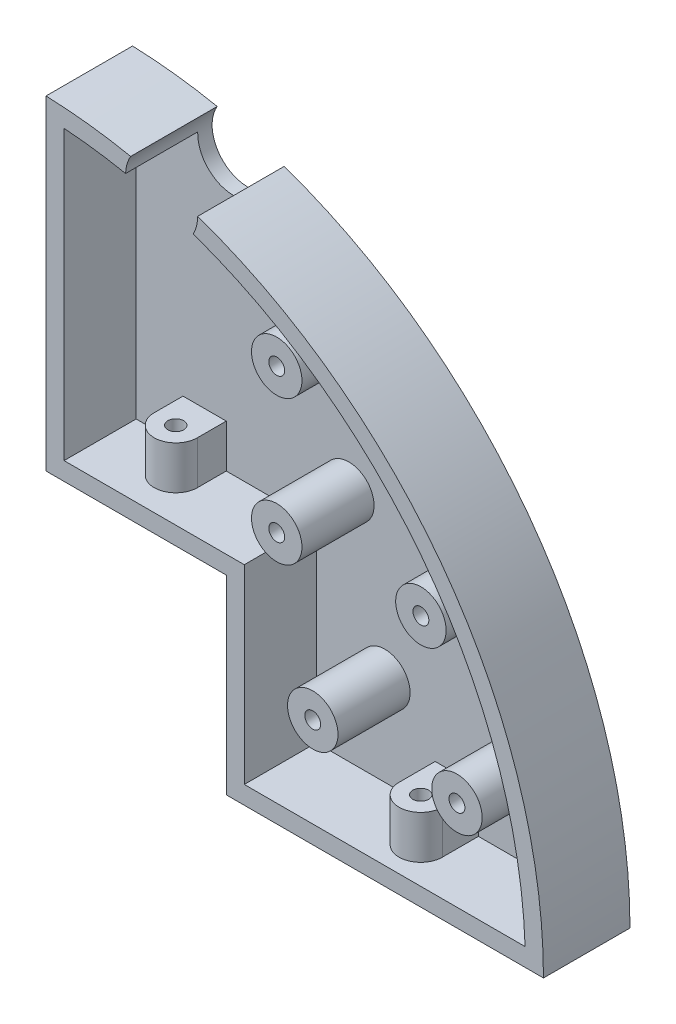
ISO-10303-21;
HEADER;
FILE_DESCRIPTION(('STEP AP214'),'2;1');
FILE_NAME('part.step','',(''),(''),'','','');
FILE_SCHEMA(('AUTOMOTIVE_DESIGN { 1 0 10303 214 1 1 1 1 }'));
ENDSEC;
DATA;
#1=APPLICATION_CONTEXT('core data for automotive mechanical design processes');
#2=APPLICATION_PROTOCOL_DEFINITION('international standard','automotive_design',2000,#1);
#3=PRODUCT_CONTEXT('',#1,'mechanical');
#4=PRODUCT('Part','Part','',(#3));
#5=PRODUCT_RELATED_PRODUCT_CATEGORY('part','',(#4));
#6=PRODUCT_DEFINITION_FORMATION('','',#4);
#7=PRODUCT_DEFINITION_CONTEXT('part definition',#1,'design');
#8=PRODUCT_DEFINITION('design','',#6,#7);
#9=PRODUCT_DEFINITION_SHAPE('','',#8);
#10=(LENGTH_UNIT() NAMED_UNIT(*) SI_UNIT(.MILLI.,.METRE.));
#11=(NAMED_UNIT(*) PLANE_ANGLE_UNIT() SI_UNIT($,.RADIAN.));
#12=(NAMED_UNIT(*) SI_UNIT($,.STERADIAN.) SOLID_ANGLE_UNIT());
#13=UNCERTAINTY_MEASURE_WITH_UNIT(LENGTH_MEASURE(1.E-05),#10,'distance_accuracy_value','');
#14=(GEOMETRIC_REPRESENTATION_CONTEXT(3) GLOBAL_UNCERTAINTY_ASSIGNED_CONTEXT((#13)) GLOBAL_UNIT_ASSIGNED_CONTEXT((#10,
#11,#12)) REPRESENTATION_CONTEXT('',''));
#15=CARTESIAN_POINT('',(0.,0.,0.));
#16=DIRECTION('',(0.,0.,1.));
#17=DIRECTION('',(1.,0.,0.));
#18=AXIS2_PLACEMENT_3D('',#15,#16,#17);
#19=CARTESIAN_POINT('',(0.,0.,2.54));
#20=DIRECTION('',(0.,0.,1.));
#21=DIRECTION('',(1.,0.,0.));
#22=AXIS2_PLACEMENT_3D('',#19,#20,#21);
#23=PLANE('',#22);
#24=CARTESIAN_POINT('',(69.215,44.45,2.54));
#25=DIRECTION('',(0.,0.,1.));
#26=DIRECTION('',(1.,0.,0.));
#27=AXIS2_PLACEMENT_3D('',#24,#25,#26);
#28=CIRCLE('',#27,4.445);
#29=CARTESIAN_POINT('',(73.66,44.45,2.54));
#30=VERTEX_POINT('',#29);
#31=EDGE_CURVE('E276',#30,#30,#28,.T.);
#32=ORIENTED_EDGE('',*,*,#31,.F.);
#33=EDGE_LOOP('',(#32));
#34=FACE_BOUND('',#33,.T.);
#35=CARTESIAN_POINT('',(75.565,19.05,2.54));
#36=DIRECTION('',(0.,0.,1.));
#37=DIRECTION('',(1.,0.,0.));
#38=AXIS2_PLACEMENT_3D('',#35,#36,#37);
#39=CIRCLE('',#38,4.445);
#40=CARTESIAN_POINT('',(80.01,19.05,2.54));
#41=VERTEX_POINT('',#40);
#42=EDGE_CURVE('E284',#41,#41,#39,.T.);
#43=ORIENTED_EDGE('',*,*,#42,.F.);
#44=EDGE_LOOP('',(#43));
#45=FACE_BOUND('',#44,.T.);
#46=CARTESIAN_POINT('',(50.165,19.05,2.54));
#47=DIRECTION('',(0.,0.,1.));
#48=DIRECTION('',(1.,0.,0.));
#49=AXIS2_PLACEMENT_3D('',#46,#47,#48);
#50=CIRCLE('',#49,4.44499999999999);
#51=CARTESIAN_POINT('',(54.61,19.05,2.54));
#52=VERTEX_POINT('',#51);
#53=EDGE_CURVE('E292',#52,#52,#50,.T.);
#54=ORIENTED_EDGE('',*,*,#53,.F.);
#55=EDGE_LOOP('',(#54));
#56=FACE_BOUND('',#55,.T.);
#57=CARTESIAN_POINT('',(43.815,69.85,2.54));
#58=DIRECTION('',(0.,0.,1.));
#59=DIRECTION('',(1.,0.,0.));
#60=AXIS2_PLACEMENT_3D('',#57,#58,#59);
#61=CIRCLE('',#60,4.445);
#62=CARTESIAN_POINT('',(48.26,69.85,2.54));
#63=VERTEX_POINT('',#62);
#64=EDGE_CURVE('E300',#63,#63,#61,.T.);
#65=ORIENTED_EDGE('',*,*,#64,.F.);
#66=EDGE_LOOP('',(#65));
#67=FACE_BOUND('',#66,.T.);
#68=CARTESIAN_POINT('',(43.815,44.45,2.54));
#69=DIRECTION('',(0.,0.,1.));
#70=DIRECTION('',(1.,0.,0.));
#71=AXIS2_PLACEMENT_3D('',#68,#69,#70);
#72=CIRCLE('',#71,4.445);
#73=CARTESIAN_POINT('',(48.26,44.45,2.54));
#74=VERTEX_POINT('',#73);
#75=EDGE_CURVE('E308',#74,#74,#72,.T.);
#76=ORIENTED_EDGE('',*,*,#75,.F.);
#77=EDGE_LOOP('',(#76));
#78=FACE_BOUND('',#77,.T.);
#79=DIRECTION('',(1.,0.,0.));
#80=VECTOR('',#79,1.);
#81=CARTESIAN_POINT('',(38.1,3.175,2.54));
#82=LINE('',#81,#80);
#83=CARTESIAN_POINT('',(38.1,3.175,2.54));
#84=VERTEX_POINT('',#83);
#85=CARTESIAN_POINT('',(59.0262314974696,3.175,2.54));
#86=VERTEX_POINT('',#85);
#87=EDGE_CURVE('E387',#84,#86,#82,.T.);
#88=ORIENTED_EDGE('',*,*,#87,.T.);
#89=DIRECTION('',(0.,-1.,0.));
#90=VECTOR('',#89,1.);
#91=CARTESIAN_POINT('',(59.0262314974696,10.795,2.54));
#92=LINE('',#91,#90);
#93=CARTESIAN_POINT('',(59.0262314974696,10.795,2.54));
#94=VERTEX_POINT('',#93);
#95=EDGE_CURVE('E514',#94,#86,#92,.T.);
#96=ORIENTED_EDGE('',*,*,#95,.F.);
#97=DIRECTION('',(-1.,0.,0.));
#98=VECTOR('',#97,1.);
#99=CARTESIAN_POINT('',(66.6462314974696,10.795,2.54));
#100=LINE('',#99,#98);
#101=CARTESIAN_POINT('',(66.6462314974696,10.795,2.54));
#102=VERTEX_POINT('',#101);
#103=EDGE_CURVE('E201',#102,#94,#100,.T.);
#104=ORIENTED_EDGE('',*,*,#103,.F.);
#105=DIRECTION('',(0.,-1.,0.));
#106=VECTOR('',#105,1.);
#107=CARTESIAN_POINT('',(66.6462314974696,10.795,2.54));
#108=LINE('',#107,#106);
#109=CARTESIAN_POINT('',(66.6462314974696,3.175,2.54));
#110=VERTEX_POINT('',#109);
#111=EDGE_CURVE('E219',#102,#110,#108,.T.);
#112=ORIENTED_EDGE('',*,*,#111,.T.);
#113=CARTESIAN_POINT('',(87.5724629949392,3.175,2.54));
#114=VERTEX_POINT('',#113);
#115=EDGE_CURVE('E386',#110,#114,#82,.T.);
#116=ORIENTED_EDGE('',*,*,#115,.T.);
#117=CARTESIAN_POINT('',(0.,0.,2.54));
#118=DIRECTION('',(0.,0.,1.));
#119=DIRECTION('',(-1.,0.,0.));
#120=AXIS2_PLACEMENT_3D('',#117,#118,#119);
#121=CIRCLE('',#120,87.63);
#122=CARTESIAN_POINT('',(29.099728785197,82.6572603261684,2.54));
#123=VERTEX_POINT('',#122);
#124=EDGE_CURVE('E360',#114,#123,#121,.T.);
#125=ORIENTED_EDGE('',*,*,#124,.T.);
#126=CARTESIAN_POINT('',(23.5407769941292,85.7265525873558,2.54));
#127=DIRECTION('',(0.,0.,1.));
#128=DIRECTION('',(1.,0.,0.));
#129=AXIS2_PLACEMENT_3D('',#126,#127,#128);
#130=CIRCLE('',#129,6.35);
#131=CARTESIAN_POINT('',(17.1939298097885,85.9266296190888,2.54));
#132=VERTEX_POINT('',#131);
#133=EDGE_CURVE('E263',#132,#123,#130,.T.);
#134=ORIENTED_EDGE('',*,*,#133,.F.);
#135=CARTESIAN_POINT('',(6.35000000000002,87.3996247131531,2.54));
#136=VERTEX_POINT('',#135);
#137=EDGE_CURVE('E391',#132,#136,#121,.T.);
#138=ORIENTED_EDGE('',*,*,#137,.T.);
#139=DIRECTION('',(0.,-1.,0.));
#140=VECTOR('',#139,1.);
#141=CARTESIAN_POINT('',(6.35000000000001,36.703,2.54));
#142=LINE('',#141,#140);
#143=CARTESIAN_POINT('',(6.35000000000001,36.703,2.54));
#144=VERTEX_POINT('',#143);
#145=EDGE_CURVE('E355',#136,#144,#142,.T.);
#146=ORIENTED_EDGE('',*,*,#145,.T.);
#147=DIRECTION('',(1.,0.,0.));
#148=VECTOR('',#147,1.);
#149=CARTESIAN_POINT('',(6.35000000000001,36.703,2.54));
#150=LINE('',#149,#148);
#151=CARTESIAN_POINT('',(14.605,36.703,2.54));
#152=VERTEX_POINT('',#151);
#153=EDGE_CURVE('E379',#144,#152,#150,.T.);
#154=ORIENTED_EDGE('',*,*,#153,.T.);
#155=DIRECTION('',(0.,1.,0.));
#156=VECTOR('',#155,1.);
#157=CARTESIAN_POINT('',(14.605,0.,2.54));
#158=LINE('',#157,#156);
#159=CARTESIAN_POINT('',(14.605,44.323,2.54));
#160=VERTEX_POINT('',#159);
#161=EDGE_CURVE('E477',#152,#160,#158,.T.);
#162=ORIENTED_EDGE('',*,*,#161,.T.);
#163=DIRECTION('',(-1.,0.,0.));
#164=VECTOR('',#163,1.);
#165=CARTESIAN_POINT('',(0.,44.323,2.54));
#166=LINE('',#165,#164);
#167=CARTESIAN_POINT('',(22.225,44.323,2.54));
#168=VERTEX_POINT('',#167);
#169=EDGE_CURVE('E473',#168,#160,#166,.T.);
#170=ORIENTED_EDGE('',*,*,#169,.F.);
#171=DIRECTION('',(0.,-1.,0.));
#172=VECTOR('',#171,1.);
#173=CARTESIAN_POINT('',(22.225,0.,2.54));
#174=LINE('',#173,#172);
#175=CARTESIAN_POINT('',(22.225,36.703,2.54));
#176=VERTEX_POINT('',#175);
#177=EDGE_CURVE('E480',#168,#176,#174,.T.);
#178=ORIENTED_EDGE('',*,*,#177,.T.);
#179=CARTESIAN_POINT('',(38.1,36.703,2.54));
#180=VERTEX_POINT('',#179);
#181=EDGE_CURVE('E378',#176,#180,#150,.T.);
#182=ORIENTED_EDGE('',*,*,#181,.T.);
#183=DIRECTION('',(0.,-1.,0.));
#184=VECTOR('',#183,1.);
#185=CARTESIAN_POINT('',(38.1,36.703,2.54));
#186=LINE('',#185,#184);
#187=EDGE_CURVE('E383',#180,#84,#186,.T.);
#188=ORIENTED_EDGE('',*,*,#187,.T.);
#189=EDGE_LOOP('',(#88,#96,#104,#112,#116,#125,#134,#138,#146,#154,#162,#170,#178,#182,#188));
#190=FACE_BOUND('',#189,.T.);
#191=ADVANCED_FACE('F39',(#34,#45,#56,#67,#78,#190),#23,.T.);
#192=CARTESIAN_POINT('',(38.1,3.175,15.24));
#193=DIRECTION('',(0.,1.,0.));
#194=DIRECTION('',(0.,0.,1.));
#195=AXIS2_PLACEMENT_3D('',#192,#193,#194);
#196=PLANE('',#195);
#197=CARTESIAN_POINT('',(62.8362314974696,3.175,8.89));
#198=DIRECTION('',(0.,1.,0.));
#199=DIRECTION('',(0.,0.,1.));
#200=AXIS2_PLACEMENT_3D('',#197,#198,#199);
#201=CIRCLE('',#200,3.81);
#202=CARTESIAN_POINT('',(59.0262314974696,3.175,8.89));
#203=VERTEX_POINT('',#202);
#204=CARTESIAN_POINT('',(66.6462314974696,3.175,8.89));
#205=VERTEX_POINT('',#204);
#206=EDGE_CURVE('E524',#203,#205,#201,.T.);
#207=ORIENTED_EDGE('',*,*,#206,.F.);
#208=DIRECTION('',(0.,0.,1.));
#209=VECTOR('',#208,1.);
#210=CARTESIAN_POINT('',(59.0262314974696,3.175,2.54));
#211=LINE('',#210,#209);
#212=EDGE_CURVE('E209',#86,#203,#211,.T.);
#213=ORIENTED_EDGE('',*,*,#212,.F.);
#214=ORIENTED_EDGE('',*,*,#87,.F.);
#215=DIRECTION('',(0.,0.,-1.));
#216=VECTOR('',#215,1.);
#217=CARTESIAN_POINT('',(38.1,3.175,15.24));
#218=LINE('',#217,#216);
#219=CARTESIAN_POINT('',(38.1,3.175,15.24));
#220=VERTEX_POINT('',#219);
#221=EDGE_CURVE('E402',#220,#84,#218,.T.);
#222=ORIENTED_EDGE('',*,*,#221,.F.);
#223=DIRECTION('',(1.,0.,0.));
#224=VECTOR('',#223,1.);
#225=CARTESIAN_POINT('',(38.1,3.175,15.24));
#226=LINE('',#225,#224);
#227=CARTESIAN_POINT('',(87.5724629949392,3.175,15.24));
#228=VERTEX_POINT('',#227);
#229=EDGE_CURVE('E366',#220,#228,#226,.T.);
#230=ORIENTED_EDGE('',*,*,#229,.T.);
#231=DIRECTION('',(0.,0.,-1.));
#232=VECTOR('',#231,1.);
#233=CARTESIAN_POINT('',(87.5724629949392,3.175,15.24));
#234=LINE('',#233,#232);
#235=EDGE_CURVE('E398',#228,#114,#234,.T.);
#236=ORIENTED_EDGE('',*,*,#235,.T.);
#237=ORIENTED_EDGE('',*,*,#115,.F.);
#238=DIRECTION('',(0.,0.,-1.));
#239=VECTOR('',#238,1.);
#240=CARTESIAN_POINT('',(66.6462314974696,3.175,8.89));
#241=LINE('',#240,#239);
#242=EDGE_CURVE('E205',#205,#110,#241,.T.);
#243=ORIENTED_EDGE('',*,*,#242,.F.);
#244=EDGE_LOOP('',(#207,#213,#214,#222,#230,#236,#237,#243));
#245=FACE_BOUND('',#244,.T.);
#246=ADVANCED_FACE('F513',(#245),#196,.T.);
#247=CARTESIAN_POINT('',(0.,0.,2.54));
#248=DIRECTION('',(0.,0.,-1.));
#249=DIRECTION('',(-1.,0.,0.));
#250=AXIS2_PLACEMENT_3D('',#247,#248,#249);
#251=CYLINDRICAL_SURFACE('',#250,90.805);
#252=CARTESIAN_POINT('',(0.,0.,0.));
#253=DIRECTION('',(0.,0.,1.));
#254=DIRECTION('',(1.,0.,0.));
#255=AXIS2_PLACEMENT_3D('',#252,#253,#254);
#256=CIRCLE('',#255,90.805);
#257=CARTESIAN_POINT('',(90.805,0.,0.));
#258=VERTEX_POINT('',#257);
#259=CARTESIAN_POINT('',(29.8907520956582,85.7443348808299,0.));
#260=VERTEX_POINT('',#259);
#261=EDGE_CURVE('E443',#258,#260,#256,.T.);
#262=ORIENTED_EDGE('',*,*,#261,.T.);
#263=DIRECTION('',(0.,0.,1.));
#264=VECTOR('',#263,1.);
#265=CARTESIAN_POINT('',(29.8907520956582,85.7443348808299,7.62));
#266=LINE('',#265,#264);
#267=CARTESIAN_POINT('',(29.8907520956582,85.7443348808299,15.24));
#268=VERTEX_POINT('',#267);
#269=EDGE_CURVE('E272',#260,#268,#266,.T.);
#270=ORIENTED_EDGE('',*,*,#269,.T.);
#271=CARTESIAN_POINT('',(0.,0.,15.24));
#272=DIRECTION('',(0.,0.,1.));
#273=DIRECTION('',(1.,0.,0.));
#274=AXIS2_PLACEMENT_3D('',#271,#272,#273);
#275=CIRCLE('',#274,90.805);
#276=CARTESIAN_POINT('',(90.805,0.,15.24));
#277=VERTEX_POINT('',#276);
#278=EDGE_CURVE('E427',#277,#268,#275,.T.);
#279=ORIENTED_EDGE('',*,*,#278,.F.);
#280=DIRECTION('',(0.,0.,-1.));
#281=VECTOR('',#280,1.);
#282=CARTESIAN_POINT('',(90.805,0.,2.54));
#283=LINE('',#282,#281);
#284=EDGE_CURVE('E465',#277,#258,#283,.T.);
#285=ORIENTED_EDGE('',*,*,#284,.T.);
#286=EDGE_LOOP('',(#262,#270,#279,#285));
#287=FACE_BOUND('',#286,.T.);
#288=ADVANCED_FACE('F563',(#287),#251,.T.);
#289=CARTESIAN_POINT('',(0.,0.,15.24));
#290=DIRECTION('',(0.,0.,-1.));
#291=DIRECTION('',(-1.,0.,0.));
#292=AXIS2_PLACEMENT_3D('',#289,#290,#291);
#293=CYLINDRICAL_SURFACE('',#292,87.63);
#294=DIRECTION('',(0.,0.,1.));
#295=VECTOR('',#294,1.);
#296=CARTESIAN_POINT('',(29.0997287851969,82.6572603261685,7.62));
#297=LINE('',#296,#295);
#298=CARTESIAN_POINT('',(29.0997287851969,82.6572603261684,15.24));
#299=VERTEX_POINT('',#298);
#300=EDGE_CURVE('E11',#123,#299,#297,.T.);
#301=ORIENTED_EDGE('',*,*,#300,.F.);
#302=ORIENTED_EDGE('',*,*,#124,.F.);
#303=ORIENTED_EDGE('',*,*,#235,.F.);
#304=CARTESIAN_POINT('',(0.,0.,15.24));
#305=DIRECTION('',(0.,0.,1.));
#306=DIRECTION('',(-1.,0.,0.));
#307=AXIS2_PLACEMENT_3D('',#304,#305,#306);
#308=CIRCLE('',#307,87.63);
#309=EDGE_CURVE('E371',#228,#299,#308,.T.);
#310=ORIENTED_EDGE('',*,*,#309,.T.);
#311=EDGE_LOOP('',(#301,#302,#303,#310));
#312=FACE_BOUND('',#311,.T.);
#313=ADVANCED_FACE('F595',(#312),#293,.F.);
#314=CARTESIAN_POINT('',(6.35000000000001,36.703,15.24));
#315=DIRECTION('',(0.,1.,0.));
#316=DIRECTION('',(-1.,0.,0.));
#317=AXIS2_PLACEMENT_3D('',#314,#315,#316);
#318=PLANE('',#317);
#319=ORIENTED_EDGE('',*,*,#181,.F.);
#320=DIRECTION('',(0.,0.,-1.));
#321=VECTOR('',#320,1.);
#322=CARTESIAN_POINT('',(22.225,36.703,0.));
#323=LINE('',#322,#321);
#324=CARTESIAN_POINT('',(22.225,36.703,7.62));
#325=VERTEX_POINT('',#324);
#326=EDGE_CURVE('E341',#325,#176,#323,.T.);
#327=ORIENTED_EDGE('',*,*,#326,.F.);
#328=CARTESIAN_POINT('',(18.415,36.703,7.62));
#329=DIRECTION('',(0.,1.,0.));
#330=DIRECTION('',(-1.,0.,0.));
#331=AXIS2_PLACEMENT_3D('',#328,#329,#330);
#332=CIRCLE('',#331,3.81);
#333=CARTESIAN_POINT('',(14.605,36.703,7.62));
#334=VERTEX_POINT('',#333);
#335=EDGE_CURVE('E324',#334,#325,#332,.T.);
#336=ORIENTED_EDGE('',*,*,#335,.F.);
#337=DIRECTION('',(0.,0.,1.));
#338=VECTOR('',#337,1.);
#339=CARTESIAN_POINT('',(14.605,36.703,7.62));
#340=LINE('',#339,#338);
#341=EDGE_CURVE('E330',#152,#334,#340,.T.);
#342=ORIENTED_EDGE('',*,*,#341,.F.);
#343=ORIENTED_EDGE('',*,*,#153,.F.);
#344=DIRECTION('',(0.,0.,-1.));
#345=VECTOR('',#344,1.);
#346=CARTESIAN_POINT('',(6.35000000000001,36.703,15.24));
#347=LINE('',#346,#345);
#348=CARTESIAN_POINT('',(6.35000000000001,36.703,15.24));
#349=VERTEX_POINT('',#348);
#350=EDGE_CURVE('E410',#349,#144,#347,.T.);
#351=ORIENTED_EDGE('',*,*,#350,.F.);
#352=DIRECTION('',(1.,0.,0.));
#353=VECTOR('',#352,1.);
#354=CARTESIAN_POINT('',(6.35000000000001,36.703,15.24));
#355=LINE('',#354,#353);
#356=CARTESIAN_POINT('',(38.1,36.703,15.24));
#357=VERTEX_POINT('',#356);
#358=EDGE_CURVE('E359',#349,#357,#355,.T.);
#359=ORIENTED_EDGE('',*,*,#358,.T.);
#360=DIRECTION('',(0.,0.,-1.));
#361=VECTOR('',#360,1.);
#362=CARTESIAN_POINT('',(38.1,36.703,15.24));
#363=LINE('',#362,#361);
#364=EDGE_CURVE('E406',#357,#180,#363,.T.);
#365=ORIENTED_EDGE('',*,*,#364,.T.);
#366=EDGE_LOOP('',(#319,#327,#336,#342,#343,#351,#359,#365));
#367=FACE_BOUND('',#366,.T.);
#368=ADVANCED_FACE('F503',(#367),#318,.T.);
#369=CARTESIAN_POINT('',(34.925,0.,2.54));
#370=DIRECTION('',(1.,0.,0.));
#371=DIRECTION('',(0.,0.,-1.));
#372=AXIS2_PLACEMENT_3D('',#369,#370,#371);
#373=PLANE('',#372);
#374=DIRECTION('',(0.,-1.,0.));
#375=VECTOR('',#374,1.);
#376=CARTESIAN_POINT('',(34.925,0.,0.));
#377=LINE('',#376,#375);
#378=CARTESIAN_POINT('',(34.925,33.528,0.));
#379=VERTEX_POINT('',#378);
#380=CARTESIAN_POINT('',(34.925,0.,0.));
#381=VERTEX_POINT('',#380);
#382=EDGE_CURVE('E435',#379,#381,#377,.T.);
#383=ORIENTED_EDGE('',*,*,#382,.T.);
#384=DIRECTION('',(0.,0.,-1.));
#385=VECTOR('',#384,1.);
#386=CARTESIAN_POINT('',(34.925,0.,2.54));
#387=LINE('',#386,#385);
#388=CARTESIAN_POINT('',(34.925,0.,15.24));
#389=VERTEX_POINT('',#388);
#390=EDGE_CURVE('E469',#389,#381,#387,.T.);
#391=ORIENTED_EDGE('',*,*,#390,.F.);
#392=DIRECTION('',(0.,-1.,0.));
#393=VECTOR('',#392,1.);
#394=CARTESIAN_POINT('',(34.925,33.528,15.24));
#395=LINE('',#394,#393);
#396=CARTESIAN_POINT('',(34.925,33.528,15.24));
#397=VERTEX_POINT('',#396);
#398=EDGE_CURVE('E418',#397,#389,#395,.T.);
#399=ORIENTED_EDGE('',*,*,#398,.F.);
#400=DIRECTION('',(0.,0.,-1.));
#401=VECTOR('',#400,1.);
#402=CARTESIAN_POINT('',(34.925,33.528,2.54));
#403=LINE('',#402,#401);
#404=EDGE_CURVE('E453',#397,#379,#403,.T.);
#405=ORIENTED_EDGE('',*,*,#404,.T.);
#406=EDGE_LOOP('',(#383,#391,#399,#405));
#407=FACE_BOUND('',#406,.T.);
#408=ADVANCED_FACE('F41',(#407),#373,.F.);
#409=CARTESIAN_POINT('',(34.925,0.,2.54));
#410=DIRECTION('',(0.,1.,0.));
#411=DIRECTION('',(0.,0.,1.));
#412=AXIS2_PLACEMENT_3D('',#409,#410,#411);
#413=PLANE('',#412);
#414=CARTESIAN_POINT('',(62.8362314974696,0.,8.89));
#415=DIRECTION('',(0.,1.,0.));
#416=DIRECTION('',(0.,0.,1.));
#417=AXIS2_PLACEMENT_3D('',#414,#415,#416);
#418=CIRCLE('',#417,1.39699999999999);
#419=CARTESIAN_POINT('',(62.8362314974696,0.,10.287));
#420=VERTEX_POINT('',#419);
#421=EDGE_CURVE('E528',#420,#420,#418,.T.);
#422=ORIENTED_EDGE('',*,*,#421,.T.);
#423=EDGE_LOOP('',(#422));
#424=FACE_BOUND('',#423,.T.);
#425=DIRECTION('',(1.,0.,0.));
#426=VECTOR('',#425,1.);
#427=CARTESIAN_POINT('',(34.925,0.,0.));
#428=LINE('',#427,#426);
#429=EDGE_CURVE('E439',#381,#258,#428,.T.);
#430=ORIENTED_EDGE('',*,*,#429,.T.);
#431=ORIENTED_EDGE('',*,*,#284,.F.);
#432=DIRECTION('',(1.,0.,0.));
#433=VECTOR('',#432,1.);
#434=CARTESIAN_POINT('',(34.925,0.,15.24));
#435=LINE('',#434,#433);
#436=EDGE_CURVE('E422',#389,#277,#435,.T.);
#437=ORIENTED_EDGE('',*,*,#436,.F.);
#438=ORIENTED_EDGE('',*,*,#390,.T.);
#439=EDGE_LOOP('',(#430,#431,#437,#438));
#440=FACE_BOUND('',#439,.T.);
#441=ADVANCED_FACE('F540',(#424,#440),#413,.F.);
#442=CARTESIAN_POINT('',(18.0903958705901,88.9847492677557,15.24));
#443=VERTEX_POINT('',#442);
#444=CARTESIAN_POINT('',(3.17500000000001,90.7494760315452,15.24));
#445=VERTEX_POINT('',#444);
#446=EDGE_CURVE('E426',#443,#445,#275,.T.);
#447=ORIENTED_EDGE('',*,*,#446,.F.);
#448=DIRECTION('',(0.,0.,1.));
#449=VECTOR('',#448,1.);
#450=CARTESIAN_POINT('',(18.0903958705901,88.9847492677557,7.62));
#451=LINE('',#450,#449);
#452=CARTESIAN_POINT('',(18.0903958705901,88.9847492677557,0.));
#453=VERTEX_POINT('',#452);
#454=EDGE_CURVE('E268',#443,#453,#451,.F.);
#455=ORIENTED_EDGE('',*,*,#454,.T.);
#456=CARTESIAN_POINT('',(3.17500000000001,90.7494760315452,0.));
#457=VERTEX_POINT('',#456);
#458=EDGE_CURVE('E442',#453,#457,#256,.T.);
#459=ORIENTED_EDGE('',*,*,#458,.T.);
#460=DIRECTION('',(0.,0.,-1.));
#461=VECTOR('',#460,1.);
#462=CARTESIAN_POINT('',(3.17500000000001,90.7494760315452,2.54));
#463=LINE('',#462,#461);
#464=EDGE_CURVE('E461',#445,#457,#463,.T.);
#465=ORIENTED_EDGE('',*,*,#464,.F.);
#466=EDGE_LOOP('',(#447,#455,#459,#465));
#467=FACE_BOUND('',#466,.T.);
#468=ADVANCED_FACE('F582',(#467),#251,.T.);
#469=CARTESIAN_POINT('',(3.175,33.528,2.54));
#470=DIRECTION('',(1.,0.,0.));
#471=DIRECTION('',(0.,1.,0.));
#472=AXIS2_PLACEMENT_3D('',#469,#470,#471);
#473=PLANE('',#472);
#474=DIRECTION('',(0.,-1.,0.));
#475=VECTOR('',#474,1.);
#476=CARTESIAN_POINT('',(3.175,33.528,0.));
#477=LINE('',#476,#475);
#478=CARTESIAN_POINT('',(3.175,33.528,0.));
#479=VERTEX_POINT('',#478);
#480=EDGE_CURVE('E447',#457,#479,#477,.T.);
#481=ORIENTED_EDGE('',*,*,#480,.T.);
#482=DIRECTION('',(0.,0.,-1.));
#483=VECTOR('',#482,1.);
#484=CARTESIAN_POINT('',(3.175,33.528,2.54));
#485=LINE('',#484,#483);
#486=CARTESIAN_POINT('',(3.175,33.528,15.24));
#487=VERTEX_POINT('',#486);
#488=EDGE_CURVE('E457',#487,#479,#485,.T.);
#489=ORIENTED_EDGE('',*,*,#488,.F.);
#490=DIRECTION('',(0.,-1.,0.));
#491=VECTOR('',#490,1.);
#492=CARTESIAN_POINT('',(3.17500000000001,90.7494760315452,15.24));
#493=LINE('',#492,#491);
#494=EDGE_CURVE('E431',#445,#487,#493,.T.);
#495=ORIENTED_EDGE('',*,*,#494,.F.);
#496=ORIENTED_EDGE('',*,*,#464,.T.);
#497=EDGE_LOOP('',(#481,#489,#495,#496));
#498=FACE_BOUND('',#497,.T.);
#499=ADVANCED_FACE('F578',(#498),#473,.F.);
#500=CARTESIAN_POINT('',(34.925,33.528,2.54));
#501=DIRECTION('',(0.,1.,0.));
#502=DIRECTION('',(0.,0.,1.));
#503=AXIS2_PLACEMENT_3D('',#500,#501,#502);
#504=PLANE('',#503);
#505=CARTESIAN_POINT('',(18.415,33.528,7.62));
#506=DIRECTION('',(0.,1.,0.));
#507=DIRECTION('',(0.,0.,1.));
#508=AXIS2_PLACEMENT_3D('',#505,#506,#507);
#509=CIRCLE('',#508,1.397);
#510=CARTESIAN_POINT('',(18.415,33.528,9.017));
#511=VERTEX_POINT('',#510);
#512=EDGE_CURVE('E320',#511,#511,#509,.T.);
#513=ORIENTED_EDGE('',*,*,#512,.T.);
#514=EDGE_LOOP('',(#513));
#515=FACE_BOUND('',#514,.T.);
#516=DIRECTION('',(1.,0.,0.));
#517=VECTOR('',#516,1.);
#518=CARTESIAN_POINT('',(34.925,33.528,0.));
#519=LINE('',#518,#517);
#520=EDGE_CURVE('E450',#479,#379,#519,.T.);
#521=ORIENTED_EDGE('',*,*,#520,.T.);
#522=ORIENTED_EDGE('',*,*,#404,.F.);
#523=DIRECTION('',(1.,0.,0.));
#524=VECTOR('',#523,1.);
#525=CARTESIAN_POINT('',(3.175,33.528,15.24));
#526=LINE('',#525,#524);
#527=EDGE_CURVE('E414',#487,#397,#526,.T.);
#528=ORIENTED_EDGE('',*,*,#527,.F.);
#529=ORIENTED_EDGE('',*,*,#488,.T.);
#530=EDGE_LOOP('',(#521,#522,#528,#529));
#531=FACE_BOUND('',#530,.T.);
#532=ADVANCED_FACE('F574',(#515,#531),#504,.F.);
#533=CARTESIAN_POINT('',(0.,0.,0.));
#534=DIRECTION('',(0.,0.,1.));
#535=DIRECTION('',(1.,0.,0.));
#536=AXIS2_PLACEMENT_3D('',#533,#534,#535);
#537=PLANE('',#536);
#538=CARTESIAN_POINT('',(43.815,69.85,0.));
#539=DIRECTION('',(0.,0.,1.));
#540=DIRECTION('',(1.,0.,0.));
#541=AXIS2_PLACEMENT_3D('',#538,#539,#540);
#542=CIRCLE('',#541,1.39700000000001);
#543=CARTESIAN_POINT('',(45.212,69.85,0.));
#544=VERTEX_POINT('',#543);
#545=EDGE_CURVE('E223',#544,#544,#542,.T.);
#546=ORIENTED_EDGE('',*,*,#545,.T.);
#547=EDGE_LOOP('',(#546));
#548=FACE_BOUND('',#547,.T.);
#549=CARTESIAN_POINT('',(43.815,44.45,0.));
#550=DIRECTION('',(0.,0.,1.));
#551=DIRECTION('',(1.,0.,0.));
#552=AXIS2_PLACEMENT_3D('',#549,#550,#551);
#553=CIRCLE('',#552,1.39700000000001);
#554=CARTESIAN_POINT('',(45.212,44.45,0.));
#555=VERTEX_POINT('',#554);
#556=EDGE_CURVE('E232',#555,#555,#553,.T.);
#557=ORIENTED_EDGE('',*,*,#556,.T.);
#558=EDGE_LOOP('',(#557));
#559=FACE_BOUND('',#558,.T.);
#560=CARTESIAN_POINT('',(69.215,44.45,0.));
#561=DIRECTION('',(0.,0.,1.));
#562=DIRECTION('',(1.,0.,0.));
#563=AXIS2_PLACEMENT_3D('',#560,#561,#562);
#564=CIRCLE('',#563,1.39699999999999);
#565=CARTESIAN_POINT('',(70.612,44.45,0.));
#566=VERTEX_POINT('',#565);
#567=EDGE_CURVE('E240',#566,#566,#564,.T.);
#568=ORIENTED_EDGE('',*,*,#567,.T.);
#569=EDGE_LOOP('',(#568));
#570=FACE_BOUND('',#569,.T.);
#571=CARTESIAN_POINT('',(75.565,19.05,0.));
#572=DIRECTION('',(0.,0.,1.));
#573=DIRECTION('',(1.,0.,0.));
#574=AXIS2_PLACEMENT_3D('',#571,#572,#573);
#575=CIRCLE('',#574,1.39699999999999);
#576=CARTESIAN_POINT('',(76.962,19.05,0.));
#577=VERTEX_POINT('',#576);
#578=EDGE_CURVE('E248',#577,#577,#575,.T.);
#579=ORIENTED_EDGE('',*,*,#578,.T.);
#580=EDGE_LOOP('',(#579));
#581=FACE_BOUND('',#580,.T.);
#582=CARTESIAN_POINT('',(50.165,19.05,0.));
#583=DIRECTION('',(0.,0.,1.));
#584=DIRECTION('',(1.,0.,0.));
#585=AXIS2_PLACEMENT_3D('',#582,#583,#584);
#586=CIRCLE('',#585,1.39700000000001);
#587=CARTESIAN_POINT('',(51.562,19.05,0.));
#588=VERTEX_POINT('',#587);
#589=EDGE_CURVE('E217',#588,#588,#586,.T.);
#590=ORIENTED_EDGE('',*,*,#589,.T.);
#591=EDGE_LOOP('',(#590));
#592=FACE_BOUND('',#591,.T.);
#593=ORIENTED_EDGE('',*,*,#458,.F.);
#594=CARTESIAN_POINT('',(23.5407769941292,85.7265525873558,0.));
#595=DIRECTION('',(0.,0.,1.));
#596=DIRECTION('',(1.,0.,0.));
#597=AXIS2_PLACEMENT_3D('',#594,#595,#596);
#598=CIRCLE('',#597,6.35);
#599=EDGE_CURVE('E259',#453,#260,#598,.T.);
#600=ORIENTED_EDGE('',*,*,#599,.T.);
#601=ORIENTED_EDGE('',*,*,#261,.F.);
#602=ORIENTED_EDGE('',*,*,#429,.F.);
#603=ORIENTED_EDGE('',*,*,#382,.F.);
#604=ORIENTED_EDGE('',*,*,#520,.F.);
#605=ORIENTED_EDGE('',*,*,#480,.F.);
#606=EDGE_LOOP('',(#593,#600,#601,#602,#603,#604,#605));
#607=FACE_BOUND('',#606,.T.);
#608=ADVANCED_FACE('F571',(#548,#559,#570,#581,#592,#607),#537,.F.);
#609=CARTESIAN_POINT('',(0.,0.,15.24));
#610=DIRECTION('',(0.,0.,1.));
#611=DIRECTION('',(1.,0.,0.));
#612=AXIS2_PLACEMENT_3D('',#609,#610,#611);
#613=PLANE('',#612);
#614=CARTESIAN_POINT('',(23.5407769941292,85.7265525873558,15.24));
#615=DIRECTION('',(0.,0.,1.));
#616=DIRECTION('',(1.,0.,0.));
#617=AXIS2_PLACEMENT_3D('',#614,#615,#616);
#618=CIRCLE('',#617,6.35);
#619=CARTESIAN_POINT('',(17.1939298097885,85.9266296190888,15.24));
#620=VERTEX_POINT('',#619);
#621=EDGE_CURVE('E63',#443,#620,#618,.T.);
#622=ORIENTED_EDGE('',*,*,#621,.F.);
#623=ORIENTED_EDGE('',*,*,#446,.T.);
#624=ORIENTED_EDGE('',*,*,#494,.T.);
#625=ORIENTED_EDGE('',*,*,#527,.T.);
#626=ORIENTED_EDGE('',*,*,#398,.T.);
#627=ORIENTED_EDGE('',*,*,#436,.T.);
#628=ORIENTED_EDGE('',*,*,#278,.T.);
#629=EDGE_CURVE('E227',#299,#268,#618,.T.);
#630=ORIENTED_EDGE('',*,*,#629,.F.);
#631=ORIENTED_EDGE('',*,*,#309,.F.);
#632=ORIENTED_EDGE('',*,*,#229,.F.);
#633=DIRECTION('',(0.,-1.,0.));
#634=VECTOR('',#633,1.);
#635=CARTESIAN_POINT('',(38.1,36.703,15.24));
#636=LINE('',#635,#634);
#637=EDGE_CURVE('E363',#357,#220,#636,.T.);
#638=ORIENTED_EDGE('',*,*,#637,.F.);
#639=ORIENTED_EDGE('',*,*,#358,.F.);
#640=DIRECTION('',(0.,-1.,0.));
#641=VECTOR('',#640,1.);
#642=CARTESIAN_POINT('',(6.35000000000001,36.703,15.24));
#643=LINE('',#642,#641);
#644=CARTESIAN_POINT('',(6.35000000000002,87.3996247131531,15.24));
#645=VERTEX_POINT('',#644);
#646=EDGE_CURVE('E356',#645,#349,#643,.T.);
#647=ORIENTED_EDGE('',*,*,#646,.F.);
#648=EDGE_CURVE('E370',#620,#645,#308,.T.);
#649=ORIENTED_EDGE('',*,*,#648,.F.);
#650=EDGE_LOOP('',(#622,#623,#624,#625,#626,#627,#628,#630,#631,#632,#638,#639,#647,#649));
#651=FACE_BOUND('',#650,.T.);
#652=ADVANCED_FACE('F569',(#651),#613,.T.);
#653=CARTESIAN_POINT('',(6.35000000000001,36.703,15.24));
#654=DIRECTION('',(1.,0.,0.));
#655=DIRECTION('',(0.,0.,-1.));
#656=AXIS2_PLACEMENT_3D('',#653,#654,#655);
#657=PLANE('',#656);
#658=ORIENTED_EDGE('',*,*,#145,.F.);
#659=DIRECTION('',(0.,0.,-1.));
#660=VECTOR('',#659,1.);
#661=CARTESIAN_POINT('',(6.35000000000002,87.3996247131531,15.24));
#662=LINE('',#661,#660);
#663=EDGE_CURVE('E375',#645,#136,#662,.T.);
#664=ORIENTED_EDGE('',*,*,#663,.F.);
#665=ORIENTED_EDGE('',*,*,#646,.T.);
#666=ORIENTED_EDGE('',*,*,#350,.T.);
#667=EDGE_LOOP('',(#658,#664,#665,#666));
#668=FACE_BOUND('',#667,.T.);
#669=ADVANCED_FACE('F615',(#668),#657,.T.);
#670=CARTESIAN_POINT('',(38.1,36.703,15.24));
#671=DIRECTION('',(1.,0.,0.));
#672=DIRECTION('',(0.,1.,0.));
#673=AXIS2_PLACEMENT_3D('',#670,#671,#672);
#674=PLANE('',#673);
#675=ORIENTED_EDGE('',*,*,#187,.F.);
#676=ORIENTED_EDGE('',*,*,#364,.F.);
#677=ORIENTED_EDGE('',*,*,#637,.T.);
#678=ORIENTED_EDGE('',*,*,#221,.T.);
#679=EDGE_LOOP('',(#675,#676,#677,#678));
#680=FACE_BOUND('',#679,.T.);
#681=ADVANCED_FACE('F508',(#680),#674,.T.);
#682=DIRECTION('',(0.,0.,1.));
#683=VECTOR('',#682,1.);
#684=CARTESIAN_POINT('',(17.1939298097885,85.9266296190888,7.62));
#685=LINE('',#684,#683);
#686=EDGE_CURVE('E48',#620,#132,#685,.F.);
#687=ORIENTED_EDGE('',*,*,#686,.F.);
#688=ORIENTED_EDGE('',*,*,#648,.T.);
#689=ORIENTED_EDGE('',*,*,#663,.T.);
#690=ORIENTED_EDGE('',*,*,#137,.F.);
#691=EDGE_LOOP('',(#687,#688,#689,#690));
#692=FACE_BOUND('',#691,.T.);
#693=ADVANCED_FACE('F492',(#692),#293,.F.);
#694=CARTESIAN_POINT('',(18.415,44.323,7.62));
#695=DIRECTION('',(0.,-1.,0.));
#696=DIRECTION('',(1.,0.,0.));
#697=AXIS2_PLACEMENT_3D('',#694,#695,#696);
#698=CYLINDRICAL_SURFACE('',#697,3.81);
#699=ORIENTED_EDGE('',*,*,#335,.T.);
#700=DIRECTION('',(0.,-1.,0.));
#701=VECTOR('',#700,1.);
#702=CARTESIAN_POINT('',(22.225,44.323,7.62));
#703=LINE('',#702,#701);
#704=CARTESIAN_POINT('',(22.225,44.323,7.62));
#705=VERTEX_POINT('',#704);
#706=EDGE_CURVE('E351',#705,#325,#703,.T.);
#707=ORIENTED_EDGE('',*,*,#706,.F.);
#708=CARTESIAN_POINT('',(18.415,44.323,7.62));
#709=DIRECTION('',(0.,1.,0.));
#710=DIRECTION('',(-1.,0.,0.));
#711=AXIS2_PLACEMENT_3D('',#708,#709,#710);
#712=CIRCLE('',#711,3.81);
#713=CARTESIAN_POINT('',(14.605,44.323,7.62));
#714=VERTEX_POINT('',#713);
#715=EDGE_CURVE('E325',#714,#705,#712,.T.);
#716=ORIENTED_EDGE('',*,*,#715,.F.);
#717=DIRECTION('',(0.,-1.,0.));
#718=VECTOR('',#717,1.);
#719=CARTESIAN_POINT('',(14.605,44.323,7.62));
#720=LINE('',#719,#718);
#721=EDGE_CURVE('E337',#714,#334,#720,.T.);
#722=ORIENTED_EDGE('',*,*,#721,.T.);
#723=EDGE_LOOP('',(#699,#707,#716,#722));
#724=FACE_BOUND('',#723,.T.);
#725=ADVANCED_FACE('F627',(#724),#698,.T.);
#726=CARTESIAN_POINT('',(22.225,44.323,0.));
#727=DIRECTION('',(-1.,0.,0.));
#728=DIRECTION('',(0.,0.,1.));
#729=AXIS2_PLACEMENT_3D('',#726,#727,#728);
#730=PLANE('',#729);
#731=ORIENTED_EDGE('',*,*,#177,.F.);
#732=DIRECTION('',(0.,0.,-1.));
#733=VECTOR('',#732,1.);
#734=CARTESIAN_POINT('',(22.225,44.323,0.));
#735=LINE('',#734,#733);
#736=EDGE_CURVE('E329',#705,#168,#735,.T.);
#737=ORIENTED_EDGE('',*,*,#736,.F.);
#738=ORIENTED_EDGE('',*,*,#706,.T.);
#739=ORIENTED_EDGE('',*,*,#326,.T.);
#740=EDGE_LOOP('',(#731,#737,#738,#739));
#741=FACE_BOUND('',#740,.T.);
#742=ADVANCED_FACE('F632',(#741),#730,.F.);
#743=CARTESIAN_POINT('',(14.605,44.323,7.62));
#744=DIRECTION('',(1.,0.,0.));
#745=DIRECTION('',(0.,0.,-1.));
#746=AXIS2_PLACEMENT_3D('',#743,#744,#745);
#747=PLANE('',#746);
#748=ORIENTED_EDGE('',*,*,#161,.F.);
#749=ORIENTED_EDGE('',*,*,#341,.T.);
#750=ORIENTED_EDGE('',*,*,#721,.F.);
#751=DIRECTION('',(0.,0.,1.));
#752=VECTOR('',#751,1.);
#753=CARTESIAN_POINT('',(14.605,44.323,7.62));
#754=LINE('',#753,#752);
#755=EDGE_CURVE('E334',#160,#714,#754,.T.);
#756=ORIENTED_EDGE('',*,*,#755,.F.);
#757=EDGE_LOOP('',(#748,#749,#750,#756));
#758=FACE_BOUND('',#757,.T.);
#759=ADVANCED_FACE('F721',(#758),#747,.F.);
#760=CARTESIAN_POINT('',(18.415,44.323,7.62));
#761=DIRECTION('',(0.,1.,0.));
#762=DIRECTION('',(-1.,0.,0.));
#763=AXIS2_PLACEMENT_3D('',#760,#761,#762);
#764=PLANE('',#763);
#765=CARTESIAN_POINT('',(18.415,44.323,7.62));
#766=DIRECTION('',(0.,1.,0.));
#767=DIRECTION('',(-1.,0.,0.));
#768=AXIS2_PLACEMENT_3D('',#765,#766,#767);
#769=CIRCLE('',#768,1.397);
#770=CARTESIAN_POINT('',(17.018,44.323,7.62));
#771=VERTEX_POINT('',#770);
#772=EDGE_CURVE('E316',#771,#771,#769,.T.);
#773=ORIENTED_EDGE('',*,*,#772,.F.);
#774=EDGE_LOOP('',(#773));
#775=FACE_BOUND('',#774,.T.);
#776=ORIENTED_EDGE('',*,*,#736,.T.);
#777=ORIENTED_EDGE('',*,*,#169,.T.);
#778=ORIENTED_EDGE('',*,*,#755,.T.);
#779=ORIENTED_EDGE('',*,*,#715,.T.);
#780=EDGE_LOOP('',(#776,#777,#778,#779));
#781=FACE_BOUND('',#780,.T.);
#782=ADVANCED_FACE('F729',(#775,#781),#764,.T.);
#783=CARTESIAN_POINT('',(18.415,0.,7.62));
#784=DIRECTION('',(0.,1.,0.));
#785=DIRECTION('',(-1.,0.,0.));
#786=AXIS2_PLACEMENT_3D('',#783,#784,#785);
#787=CYLINDRICAL_SURFACE('',#786,1.397);
#788=ORIENTED_EDGE('',*,*,#772,.T.);
#789=EDGE_LOOP('',(#788));
#790=FACE_BOUND('',#789,.T.);
#791=ORIENTED_EDGE('',*,*,#512,.F.);
#792=EDGE_LOOP('',(#791));
#793=FACE_BOUND('',#792,.T.);
#794=ADVANCED_FACE('F737',(#790,#793),#787,.F.);
#795=CARTESIAN_POINT('',(43.815,44.45,27.8123585694968));
#796=DIRECTION('',(0.,0.,-1.));
#797=DIRECTION('',(-1.,0.,0.));
#798=AXIS2_PLACEMENT_3D('',#795,#796,#797);
#799=CYLINDRICAL_SURFACE('',#798,4.445);
#800=ORIENTED_EDGE('',*,*,#75,.T.);
#801=EDGE_LOOP('',(#800));
#802=FACE_BOUND('',#801,.T.);
#803=CARTESIAN_POINT('',(43.815,44.45,15.24));
#804=DIRECTION('',(0.,0.,1.));
#805=DIRECTION('',(1.,0.,0.));
#806=AXIS2_PLACEMENT_3D('',#803,#804,#805);
#807=CIRCLE('',#806,4.445);
#808=CARTESIAN_POINT('',(48.26,44.45,15.24));
#809=VERTEX_POINT('',#808);
#810=EDGE_CURVE('E312',#809,#809,#807,.T.);
#811=ORIENTED_EDGE('',*,*,#810,.F.);
#812=EDGE_LOOP('',(#811));
#813=FACE_BOUND('',#812,.T.);
#814=ADVANCED_FACE('F746',(#802,#813),#799,.T.);
#815=CARTESIAN_POINT('',(0.,0.,15.24));
#816=DIRECTION('',(0.,0.,1.));
#817=DIRECTION('',(1.,0.,0.));
#818=AXIS2_PLACEMENT_3D('',#815,#816,#817);
#819=PLANE('',#818);
#820=CARTESIAN_POINT('',(43.815,44.45,15.24));
#821=DIRECTION('',(0.,0.,1.));
#822=DIRECTION('',(1.,0.,0.));
#823=AXIS2_PLACEMENT_3D('',#820,#821,#822);
#824=CIRCLE('',#823,1.39700000000001);
#825=CARTESIAN_POINT('',(45.212,44.45,15.24));
#826=VERTEX_POINT('',#825);
#827=EDGE_CURVE('E236',#826,#826,#824,.T.);
#828=ORIENTED_EDGE('',*,*,#827,.F.);
#829=EDGE_LOOP('',(#828));
#830=FACE_BOUND('',#829,.T.);
#831=ORIENTED_EDGE('',*,*,#810,.T.);
#832=EDGE_LOOP('',(#831));
#833=FACE_BOUND('',#832,.T.);
#834=ADVANCED_FACE('F755',(#830,#833),#819,.T.);
#835=CARTESIAN_POINT('',(43.815,69.85,27.8123585694968));
#836=DIRECTION('',(0.,0.,-1.));
#837=DIRECTION('',(-1.,0.,0.));
#838=AXIS2_PLACEMENT_3D('',#835,#836,#837);
#839=CYLINDRICAL_SURFACE('',#838,4.445);
#840=ORIENTED_EDGE('',*,*,#64,.T.);
#841=EDGE_LOOP('',(#840));
#842=FACE_BOUND('',#841,.T.);
#843=CARTESIAN_POINT('',(43.815,69.85,15.24));
#844=DIRECTION('',(0.,0.,1.));
#845=DIRECTION('',(1.,0.,0.));
#846=AXIS2_PLACEMENT_3D('',#843,#844,#845);
#847=CIRCLE('',#846,4.445);
#848=CARTESIAN_POINT('',(48.26,69.85,15.24));
#849=VERTEX_POINT('',#848);
#850=EDGE_CURVE('E304',#849,#849,#847,.T.);
#851=ORIENTED_EDGE('',*,*,#850,.F.);
#852=EDGE_LOOP('',(#851));
#853=FACE_BOUND('',#852,.T.);
#854=ADVANCED_FACE('F764',(#842,#853),#839,.T.);
#855=CARTESIAN_POINT('',(0.,0.,15.24));
#856=DIRECTION('',(0.,0.,1.));
#857=DIRECTION('',(1.,0.,0.));
#858=AXIS2_PLACEMENT_3D('',#855,#856,#857);
#859=PLANE('',#858);
#860=CARTESIAN_POINT('',(43.815,69.85,15.24));
#861=DIRECTION('',(0.,0.,1.));
#862=DIRECTION('',(1.,0.,0.));
#863=AXIS2_PLACEMENT_3D('',#860,#861,#862);
#864=CIRCLE('',#863,1.39700000000001);
#865=CARTESIAN_POINT('',(45.212,69.85,15.24));
#866=VERTEX_POINT('',#865);
#867=EDGE_CURVE('E228',#866,#866,#864,.T.);
#868=ORIENTED_EDGE('',*,*,#867,.F.);
#869=EDGE_LOOP('',(#868));
#870=FACE_BOUND('',#869,.T.);
#871=ORIENTED_EDGE('',*,*,#850,.T.);
#872=EDGE_LOOP('',(#871));
#873=FACE_BOUND('',#872,.T.);
#874=ADVANCED_FACE('F773',(#870,#873),#859,.T.);
#875=CARTESIAN_POINT('',(50.165,19.05,27.8123585694968));
#876=DIRECTION('',(0.,0.,-1.));
#877=DIRECTION('',(-1.,0.,0.));
#878=AXIS2_PLACEMENT_3D('',#875,#876,#877);
#879=CYLINDRICAL_SURFACE('',#878,4.44499999999999);
#880=ORIENTED_EDGE('',*,*,#53,.T.);
#881=EDGE_LOOP('',(#880));
#882=FACE_BOUND('',#881,.T.);
#883=CARTESIAN_POINT('',(50.165,19.05,15.24));
#884=DIRECTION('',(0.,0.,1.));
#885=DIRECTION('',(1.,0.,0.));
#886=AXIS2_PLACEMENT_3D('',#883,#884,#885);
#887=CIRCLE('',#886,4.44499999999999);
#888=CARTESIAN_POINT('',(54.61,19.05,15.24));
#889=VERTEX_POINT('',#888);
#890=EDGE_CURVE('E296',#889,#889,#887,.T.);
#891=ORIENTED_EDGE('',*,*,#890,.F.);
#892=EDGE_LOOP('',(#891));
#893=FACE_BOUND('',#892,.T.);
#894=ADVANCED_FACE('F782',(#882,#893),#879,.T.);
#895=CARTESIAN_POINT('',(0.,0.,15.24));
#896=DIRECTION('',(0.,0.,1.));
#897=DIRECTION('',(1.,0.,0.));
#898=AXIS2_PLACEMENT_3D('',#895,#896,#897);
#899=PLANE('',#898);
#900=CARTESIAN_POINT('',(50.165,19.05,15.24));
#901=DIRECTION('',(0.,0.,1.));
#902=DIRECTION('',(1.,0.,0.));
#903=AXIS2_PLACEMENT_3D('',#900,#901,#902);
#904=CIRCLE('',#903,1.39700000000001);
#905=CARTESIAN_POINT('',(51.562,19.05,15.24));
#906=VERTEX_POINT('',#905);
#907=EDGE_CURVE('E212',#906,#906,#904,.T.);
#908=ORIENTED_EDGE('',*,*,#907,.F.);
#909=EDGE_LOOP('',(#908));
#910=FACE_BOUND('',#909,.T.);
#911=ORIENTED_EDGE('',*,*,#890,.T.);
#912=EDGE_LOOP('',(#911));
#913=FACE_BOUND('',#912,.T.);
#914=ADVANCED_FACE('F791',(#910,#913),#899,.T.);
#915=CARTESIAN_POINT('',(75.565,19.05,27.8123585694968));
#916=DIRECTION('',(0.,0.,-1.));
#917=DIRECTION('',(-1.,0.,0.));
#918=AXIS2_PLACEMENT_3D('',#915,#916,#917);
#919=CYLINDRICAL_SURFACE('',#918,4.445);
#920=ORIENTED_EDGE('',*,*,#42,.T.);
#921=EDGE_LOOP('',(#920));
#922=FACE_BOUND('',#921,.T.);
#923=CARTESIAN_POINT('',(75.565,19.05,15.24));
#924=DIRECTION('',(0.,0.,1.));
#925=DIRECTION('',(1.,0.,0.));
#926=AXIS2_PLACEMENT_3D('',#923,#924,#925);
#927=CIRCLE('',#926,4.445);
#928=CARTESIAN_POINT('',(80.01,19.05,15.24));
#929=VERTEX_POINT('',#928);
#930=EDGE_CURVE('E288',#929,#929,#927,.T.);
#931=ORIENTED_EDGE('',*,*,#930,.F.);
#932=EDGE_LOOP('',(#931));
#933=FACE_BOUND('',#932,.T.);
#934=ADVANCED_FACE('F800',(#922,#933),#919,.T.);
#935=CARTESIAN_POINT('',(0.,0.,15.24));
#936=DIRECTION('',(0.,0.,1.));
#937=DIRECTION('',(1.,0.,0.));
#938=AXIS2_PLACEMENT_3D('',#935,#936,#937);
#939=PLANE('',#938);
#940=CARTESIAN_POINT('',(75.565,19.05,15.24));
#941=DIRECTION('',(0.,0.,1.));
#942=DIRECTION('',(1.,0.,0.));
#943=AXIS2_PLACEMENT_3D('',#940,#941,#942);
#944=CIRCLE('',#943,1.39699999999999);
#945=CARTESIAN_POINT('',(76.962,19.05,15.24));
#946=VERTEX_POINT('',#945);
#947=EDGE_CURVE('E252',#946,#946,#944,.T.);
#948=ORIENTED_EDGE('',*,*,#947,.F.);
#949=EDGE_LOOP('',(#948));
#950=FACE_BOUND('',#949,.T.);
#951=ORIENTED_EDGE('',*,*,#930,.T.);
#952=EDGE_LOOP('',(#951));
#953=FACE_BOUND('',#952,.T.);
#954=ADVANCED_FACE('F809',(#950,#953),#939,.T.);
#955=CARTESIAN_POINT('',(69.215,44.45,27.8123585694968));
#956=DIRECTION('',(0.,0.,-1.));
#957=DIRECTION('',(-1.,0.,0.));
#958=AXIS2_PLACEMENT_3D('',#955,#956,#957);
#959=CYLINDRICAL_SURFACE('',#958,4.445);
#960=ORIENTED_EDGE('',*,*,#31,.T.);
#961=EDGE_LOOP('',(#960));
#962=FACE_BOUND('',#961,.T.);
#963=CARTESIAN_POINT('',(69.215,44.45,15.24));
#964=DIRECTION('',(0.,0.,1.));
#965=DIRECTION('',(1.,0.,0.));
#966=AXIS2_PLACEMENT_3D('',#963,#964,#965);
#967=CIRCLE('',#966,4.445);
#968=CARTESIAN_POINT('',(73.66,44.45,15.24));
#969=VERTEX_POINT('',#968);
#970=EDGE_CURVE('E280',#969,#969,#967,.T.);
#971=ORIENTED_EDGE('',*,*,#970,.F.);
#972=EDGE_LOOP('',(#971));
#973=FACE_BOUND('',#972,.T.);
#974=ADVANCED_FACE('F818',(#962,#973),#959,.T.);
#975=CARTESIAN_POINT('',(0.,0.,15.24));
#976=DIRECTION('',(0.,0.,1.));
#977=DIRECTION('',(1.,0.,0.));
#978=AXIS2_PLACEMENT_3D('',#975,#976,#977);
#979=PLANE('',#978);
#980=CARTESIAN_POINT('',(69.215,44.45,15.24));
#981=DIRECTION('',(0.,0.,1.));
#982=DIRECTION('',(1.,0.,0.));
#983=AXIS2_PLACEMENT_3D('',#980,#981,#982);
#984=CIRCLE('',#983,1.39699999999999);
#985=CARTESIAN_POINT('',(70.612,44.45,15.24));
#986=VERTEX_POINT('',#985);
#987=EDGE_CURVE('E244',#986,#986,#984,.T.);
#988=ORIENTED_EDGE('',*,*,#987,.F.);
#989=EDGE_LOOP('',(#988));
#990=FACE_BOUND('',#989,.T.);
#991=ORIENTED_EDGE('',*,*,#970,.T.);
#992=EDGE_LOOP('',(#991));
#993=FACE_BOUND('',#992,.T.);
#994=ADVANCED_FACE('F827',(#990,#993),#979,.T.);
#995=CARTESIAN_POINT('',(23.5407769941292,85.7265525873558,0.));
#996=DIRECTION('',(0.,0.,1.));
#997=DIRECTION('',(1.,0.,0.));
#998=AXIS2_PLACEMENT_3D('',#995,#996,#997);
#999=CYLINDRICAL_SURFACE('',#998,6.35);
#1000=ORIENTED_EDGE('',*,*,#599,.F.);
#1001=ORIENTED_EDGE('',*,*,#454,.F.);
#1002=ORIENTED_EDGE('',*,*,#621,.T.);
#1003=ORIENTED_EDGE('',*,*,#686,.T.);
#1004=ORIENTED_EDGE('',*,*,#133,.T.);
#1005=ORIENTED_EDGE('',*,*,#300,.T.);
#1006=ORIENTED_EDGE('',*,*,#629,.T.);
#1007=ORIENTED_EDGE('',*,*,#269,.F.);
#1008=EDGE_LOOP('',(#1000,#1001,#1002,#1003,#1004,#1005,#1006,#1007));
#1009=FACE_BOUND('',#1008,.T.);
#1010=ADVANCED_FACE('F484',(#1009),#999,.F.);
#1011=CARTESIAN_POINT('',(69.215,44.45,0.));
#1012=DIRECTION('',(0.,0.,1.));
#1013=DIRECTION('',(1.,0.,0.));
#1014=AXIS2_PLACEMENT_3D('',#1011,#1012,#1013);
#1015=CYLINDRICAL_SURFACE('',#1014,1.39699999999999);
#1016=ORIENTED_EDGE('',*,*,#567,.F.);
#1017=EDGE_LOOP('',(#1016));
#1018=FACE_BOUND('',#1017,.T.);
#1019=ORIENTED_EDGE('',*,*,#987,.T.);
#1020=EDGE_LOOP('',(#1019));
#1021=FACE_BOUND('',#1020,.T.);
#1022=ADVANCED_FACE('F855',(#1018,#1021),#1015,.F.);
#1023=CARTESIAN_POINT('',(75.565,19.05,0.));
#1024=DIRECTION('',(0.,0.,1.));
#1025=DIRECTION('',(1.,0.,0.));
#1026=AXIS2_PLACEMENT_3D('',#1023,#1024,#1025);
#1027=CYLINDRICAL_SURFACE('',#1026,1.39699999999999);
#1028=ORIENTED_EDGE('',*,*,#578,.F.);
#1029=EDGE_LOOP('',(#1028));
#1030=FACE_BOUND('',#1029,.T.);
#1031=ORIENTED_EDGE('',*,*,#947,.T.);
#1032=EDGE_LOOP('',(#1031));
#1033=FACE_BOUND('',#1032,.T.);
#1034=ADVANCED_FACE('F862',(#1030,#1033),#1027,.F.);
#1035=CARTESIAN_POINT('',(50.165,19.05,0.));
#1036=DIRECTION('',(0.,0.,1.));
#1037=DIRECTION('',(1.,0.,0.));
#1038=AXIS2_PLACEMENT_3D('',#1035,#1036,#1037);
#1039=CYLINDRICAL_SURFACE('',#1038,1.39700000000001);
#1040=ORIENTED_EDGE('',*,*,#589,.F.);
#1041=EDGE_LOOP('',(#1040));
#1042=FACE_BOUND('',#1041,.T.);
#1043=ORIENTED_EDGE('',*,*,#907,.T.);
#1044=EDGE_LOOP('',(#1043));
#1045=FACE_BOUND('',#1044,.T.);
#1046=ADVANCED_FACE('F871',(#1042,#1045),#1039,.F.);
#1047=CARTESIAN_POINT('',(43.815,69.85,0.));
#1048=DIRECTION('',(0.,0.,1.));
#1049=DIRECTION('',(1.,0.,0.));
#1050=AXIS2_PLACEMENT_3D('',#1047,#1048,#1049);
#1051=CYLINDRICAL_SURFACE('',#1050,1.39700000000001);
#1052=ORIENTED_EDGE('',*,*,#545,.F.);
#1053=EDGE_LOOP('',(#1052));
#1054=FACE_BOUND('',#1053,.T.);
#1055=ORIENTED_EDGE('',*,*,#867,.T.);
#1056=EDGE_LOOP('',(#1055));
#1057=FACE_BOUND('',#1056,.T.);
#1058=ADVANCED_FACE('F880',(#1054,#1057),#1051,.F.);
#1059=CARTESIAN_POINT('',(43.815,44.45,0.));
#1060=DIRECTION('',(0.,0.,1.));
#1061=DIRECTION('',(1.,0.,0.));
#1062=AXIS2_PLACEMENT_3D('',#1059,#1060,#1061);
#1063=CYLINDRICAL_SURFACE('',#1062,1.39700000000001);
#1064=ORIENTED_EDGE('',*,*,#556,.F.);
#1065=EDGE_LOOP('',(#1064));
#1066=FACE_BOUND('',#1065,.T.);
#1067=ORIENTED_EDGE('',*,*,#827,.T.);
#1068=EDGE_LOOP('',(#1067));
#1069=FACE_BOUND('',#1068,.T.);
#1070=ADVANCED_FACE('F889',(#1066,#1069),#1063,.F.);
#1071=CARTESIAN_POINT('',(59.0262314974696,10.795,2.54));
#1072=DIRECTION('',(1.,0.,0.));
#1073=DIRECTION('',(0.,0.,-1.));
#1074=AXIS2_PLACEMENT_3D('',#1071,#1072,#1073);
#1075=PLANE('',#1074);
#1076=ORIENTED_EDGE('',*,*,#212,.T.);
#1077=DIRECTION('',(0.,-1.,0.));
#1078=VECTOR('',#1077,1.);
#1079=CARTESIAN_POINT('',(59.0262314974696,10.795,8.89));
#1080=LINE('',#1079,#1078);
#1081=CARTESIAN_POINT('',(59.0262314974696,10.795,8.89));
#1082=VERTEX_POINT('',#1081);
#1083=EDGE_CURVE('E191',#1082,#203,#1080,.T.);
#1084=ORIENTED_EDGE('',*,*,#1083,.F.);
#1085=DIRECTION('',(0.,0.,1.));
#1086=VECTOR('',#1085,1.);
#1087=CARTESIAN_POINT('',(59.0262314974696,10.795,2.54));
#1088=LINE('',#1087,#1086);
#1089=EDGE_CURVE('E196',#94,#1082,#1088,.T.);
#1090=ORIENTED_EDGE('',*,*,#1089,.F.);
#1091=ORIENTED_EDGE('',*,*,#95,.T.);
#1092=EDGE_LOOP('',(#1076,#1084,#1090,#1091));
#1093=FACE_BOUND('',#1092,.T.);
#1094=ADVANCED_FACE('F207',(#1093),#1075,.F.);
#1095=CARTESIAN_POINT('',(62.8362314974696,10.795,8.89));
#1096=DIRECTION('',(0.,-1.,0.));
#1097=DIRECTION('',(0.,0.,-1.));
#1098=AXIS2_PLACEMENT_3D('',#1095,#1096,#1097);
#1099=CYLINDRICAL_SURFACE('',#1098,3.81);
#1100=ORIENTED_EDGE('',*,*,#206,.T.);
#1101=DIRECTION('',(0.,-1.,0.));
#1102=VECTOR('',#1101,1.);
#1103=CARTESIAN_POINT('',(66.6462314974696,10.795,8.89));
#1104=LINE('',#1103,#1102);
#1105=CARTESIAN_POINT('',(66.6462314974696,10.795,8.89));
#1106=VERTEX_POINT('',#1105);
#1107=EDGE_CURVE('E55',#1106,#205,#1104,.T.);
#1108=ORIENTED_EDGE('',*,*,#1107,.F.);
#1109=CARTESIAN_POINT('',(62.8362314974696,10.795,8.89));
#1110=DIRECTION('',(0.,1.,0.));
#1111=DIRECTION('',(0.,0.,1.));
#1112=AXIS2_PLACEMENT_3D('',#1109,#1110,#1111);
#1113=CIRCLE('',#1112,3.81);
#1114=EDGE_CURVE('E187',#1082,#1106,#1113,.T.);
#1115=ORIENTED_EDGE('',*,*,#1114,.F.);
#1116=ORIENTED_EDGE('',*,*,#1083,.T.);
#1117=EDGE_LOOP('',(#1100,#1108,#1115,#1116));
#1118=FACE_BOUND('',#1117,.T.);
#1119=ADVANCED_FACE('F189',(#1118),#1099,.T.);
#1120=CARTESIAN_POINT('',(66.6462314974696,10.795,8.89));
#1121=DIRECTION('',(-1.,0.,0.));
#1122=DIRECTION('',(0.,0.,1.));
#1123=AXIS2_PLACEMENT_3D('',#1120,#1121,#1122);
#1124=PLANE('',#1123);
#1125=ORIENTED_EDGE('',*,*,#242,.T.);
#1126=ORIENTED_EDGE('',*,*,#111,.F.);
#1127=DIRECTION('',(0.,0.,-1.));
#1128=VECTOR('',#1127,1.);
#1129=CARTESIAN_POINT('',(66.6462314974696,10.795,8.89));
#1130=LINE('',#1129,#1128);
#1131=EDGE_CURVE('E195',#1106,#102,#1130,.T.);
#1132=ORIENTED_EDGE('',*,*,#1131,.F.);
#1133=ORIENTED_EDGE('',*,*,#1107,.T.);
#1134=EDGE_LOOP('',(#1125,#1126,#1132,#1133));
#1135=FACE_BOUND('',#1134,.T.);
#1136=ADVANCED_FACE('F550',(#1135),#1124,.F.);
#1137=CARTESIAN_POINT('',(62.8362314974696,10.795,8.89));
#1138=DIRECTION('',(0.,1.,0.));
#1139=DIRECTION('',(0.,0.,1.));
#1140=AXIS2_PLACEMENT_3D('',#1137,#1138,#1139);
#1141=PLANE('',#1140);
#1142=CARTESIAN_POINT('',(62.8362314974696,10.795,8.89));
#1143=DIRECTION('',(0.,1.,0.));
#1144=DIRECTION('',(0.,0.,1.));
#1145=AXIS2_PLACEMENT_3D('',#1142,#1143,#1144);
#1146=CIRCLE('',#1145,1.39699999999999);
#1147=CARTESIAN_POINT('',(62.8362314974696,10.795,10.287));
#1148=VERTEX_POINT('',#1147);
#1149=EDGE_CURVE('E532',#1148,#1148,#1146,.T.);
#1150=ORIENTED_EDGE('',*,*,#1149,.F.);
#1151=EDGE_LOOP('',(#1150));
#1152=FACE_BOUND('',#1151,.T.);
#1153=ORIENTED_EDGE('',*,*,#1089,.T.);
#1154=ORIENTED_EDGE('',*,*,#1114,.T.);
#1155=ORIENTED_EDGE('',*,*,#1131,.T.);
#1156=ORIENTED_EDGE('',*,*,#103,.T.);
#1157=EDGE_LOOP('',(#1153,#1154,#1155,#1156));
#1158=FACE_BOUND('',#1157,.T.);
#1159=ADVANCED_FACE('F199',(#1152,#1158),#1141,.T.);
#1160=CARTESIAN_POINT('',(62.8362314974696,0.,8.89));
#1161=DIRECTION('',(0.,1.,0.));
#1162=DIRECTION('',(0.,0.,1.));
#1163=AXIS2_PLACEMENT_3D('',#1160,#1161,#1162);
#1164=CYLINDRICAL_SURFACE('',#1163,1.39699999999999);
#1165=ORIENTED_EDGE('',*,*,#421,.F.);
#1166=EDGE_LOOP('',(#1165));
#1167=FACE_BOUND('',#1166,.T.);
#1168=ORIENTED_EDGE('',*,*,#1149,.T.);
#1169=EDGE_LOOP('',(#1168));
#1170=FACE_BOUND('',#1169,.T.);
#1171=ADVANCED_FACE('F543',(#1167,#1170),#1164,.F.);
#1172=CLOSED_SHELL('',(#191,#246,#288,#313,#368,#408,#441,#468,#499,#532,#608,#652,#669,#681,
#693,#725,#742,#759,#782,#794,#814,#834,#854,#874,#894,#914,#934,#954,#974,#994,#1010,#1022,
#1034,#1046,#1058,#1070,#1094,#1119,#1136,#1159,#1171));
#1173=MANIFOLD_SOLID_BREP('B2',#1172);
#1174=ADVANCED_BREP_SHAPE_REPRESENTATION('',(#18,#1173),#14);
#1175=SHAPE_DEFINITION_REPRESENTATION(#9,#1174);
ENDSEC;
END-ISO-10303-21;
